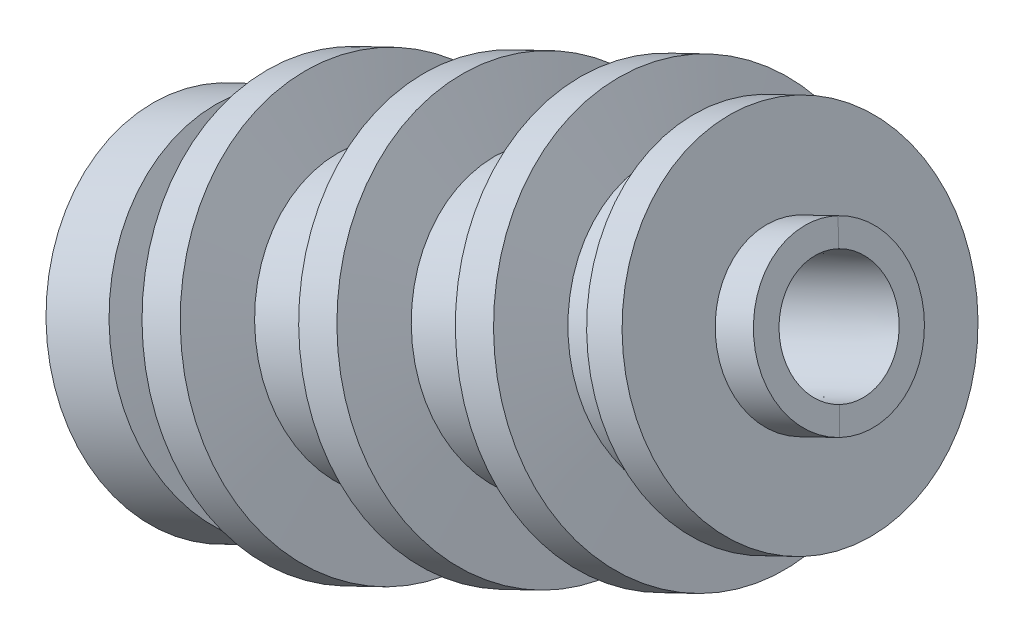
ISO-10303-21;
HEADER;
FILE_DESCRIPTION(('STEP AP214'),'2;1');
FILE_NAME('part.step','',(''),(''),'','','');
FILE_SCHEMA(('AUTOMOTIVE_DESIGN { 1 0 10303 214 1 1 1 1 }'));
ENDSEC;
DATA;
#1=APPLICATION_CONTEXT('core data for automotive mechanical design processes');
#2=APPLICATION_PROTOCOL_DEFINITION('international standard','automotive_design',2000,#1);
#3=PRODUCT_CONTEXT('',#1,'mechanical');
#4=PRODUCT('Part','Part','',(#3));
#5=PRODUCT_RELATED_PRODUCT_CATEGORY('part','',(#4));
#6=PRODUCT_DEFINITION_FORMATION('','',#4);
#7=PRODUCT_DEFINITION_CONTEXT('part definition',#1,'design');
#8=PRODUCT_DEFINITION('design','',#6,#7);
#9=PRODUCT_DEFINITION_SHAPE('','',#8);
#10=(LENGTH_UNIT() NAMED_UNIT(*) SI_UNIT(.MILLI.,.METRE.));
#11=(NAMED_UNIT(*) PLANE_ANGLE_UNIT() SI_UNIT($,.RADIAN.));
#12=(NAMED_UNIT(*) SI_UNIT($,.STERADIAN.) SOLID_ANGLE_UNIT());
#13=UNCERTAINTY_MEASURE_WITH_UNIT(LENGTH_MEASURE(1.E-05),#10,'distance_accuracy_value','');
#14=(GEOMETRIC_REPRESENTATION_CONTEXT(3) GLOBAL_UNCERTAINTY_ASSIGNED_CONTEXT((#13)) GLOBAL_UNIT_ASSIGNED_CONTEXT((#10,
#11,#12)) REPRESENTATION_CONTEXT('',''));
#15=CARTESIAN_POINT('',(0.,0.,0.));
#16=DIRECTION('',(0.,0.,1.));
#17=DIRECTION('',(1.,0.,0.));
#18=AXIS2_PLACEMENT_3D('',#15,#16,#17);
#19=CARTESIAN_POINT('',(10.638451955797,-21.5147818948786,0.));
#20=DIRECTION('',(0.90096886790242,0.433883739117557,0.));
#21=DIRECTION('',(-0.433883739117557,0.90096886790242,0.));
#22=AXIS2_PLACEMENT_3D('',#19,#20,#21);
#23=CYLINDRICAL_SURFACE('',#22,4.5);
#24=CARTESIAN_POINT('',(9.96272530484483,-21.840194699229,0.));
#25=DIRECTION('',(0.900968867902419,0.433883739117557,0.));
#26=DIRECTION('',(0.16891700663179,-0.350759778515863,-0.921105109445203));
#27=AXIS2_PLACEMENT_3D('',#24,#25,#26);
#28=CIRCLE('',#27,4.49999999998767);
#29=CARTESIAN_POINT('',(10.7228518346858,-23.4186137025461,-4.14497299249206));
#30=VERTEX_POINT('',#29);
#31=EDGE_CURVE('E120',#30,#30,#28,.F.);
#32=ORIENTED_EDGE('',*,*,#31,.F.);
#33=EDGE_LOOP('',(#32));
#34=FACE_BOUND('',#33,.T.);
#35=CARTESIAN_POINT('',(10.8636941728005,-21.4063109600858,0.));
#36=DIRECTION('',(-0.90096886790242,-0.433883739117557,0.));
#37=DIRECTION('',(-0.168917006629493,0.350759778511095,0.92110510944744));
#38=AXIS2_PLACEMENT_3D('',#35,#36,#37);
#39=CIRCLE('',#38,4.49999999997674);
#40=CARTESIAN_POINT('',(10.1035676429717,-19.827891956794,4.14497299249206));
#41=VERTEX_POINT('',#40);
#42=EDGE_CURVE('E117',#41,#41,#39,.F.);
#43=ORIENTED_EDGE('',*,*,#42,.F.);
#44=EDGE_LOOP('',(#43));
#45=FACE_BOUND('',#44,.T.);
#46=ADVANCED_FACE('F17',(#34,#45),#23,.T.);
#47=CARTESIAN_POINT('',(9.96272530485679,-21.8401946992232,0.));
#48=DIRECTION('',(0.900968867902419,0.433883739117558,0.));
#49=DIRECTION('',(-0.433883739117558,0.900968867902419,0.));
#50=AXIS2_PLACEMENT_3D('',#47,#48,#49);
#51=CONICAL_SURFACE('',#50,4.50000000010716,1.48352986421664);
#52=ORIENTED_EDGE('',*,*,#31,.T.);
#53=EDGE_LOOP('',(#52));
#54=FACE_BOUND('',#53,.T.);
#55=CARTESIAN_POINT('',(9.84448846167332,-21.8971345619083,0.));
#56=DIRECTION('',(0.900968867902419,0.433883739117557,0.));
#57=DIRECTION('',(-0.433883739117557,0.900968867902419,0.));
#58=AXIS2_PLACEMENT_3D('',#55,#56,#57);
#59=CIRCLE('',#58,3.);
#60=CARTESIAN_POINT('',(8.54283724432064,-19.1942279582011,0.));
#61=VERTEX_POINT('',#60);
#62=EDGE_CURVE('E114',#61,#61,#59,.F.);
#63=ORIENTED_EDGE('',*,*,#62,.F.);
#64=EDGE_LOOP('',(#63));
#65=FACE_BOUND('',#64,.T.);
#66=ADVANCED_FACE('F347',(#54,#65),#51,.T.);
#67=CARTESIAN_POINT('',(10.8636941728005,-21.4063109600858,0.));
#68=DIRECTION('',(-0.90096886790242,-0.433883739117557,0.));
#69=DIRECTION('',(0.433883739117557,-0.900968867902419,0.));
#70=AXIS2_PLACEMENT_3D('',#67,#68,#69);
#71=CONICAL_SURFACE('',#70,4.49999999997674,1.48352986419634);
#72=CARTESIAN_POINT('',(10.9819310159695,-21.3493710974077,0.));
#73=DIRECTION('',(0.90096886790242,0.433883739117557,0.));
#74=DIRECTION('',(-0.433883739117557,0.90096886790242,0.));
#75=AXIS2_PLACEMENT_3D('',#72,#73,#74);
#76=CIRCLE('',#75,3.);
#77=CARTESIAN_POINT('',(9.68027979861681,-18.6464644937004,0.));
#78=VERTEX_POINT('',#77);
#79=EDGE_CURVE('E111',#78,#78,#76,.T.);
#80=ORIENTED_EDGE('',*,*,#79,.F.);
#81=EDGE_LOOP('',(#80));
#82=FACE_BOUND('',#81,.T.);
#83=ORIENTED_EDGE('',*,*,#42,.T.);
#84=EDGE_LOOP('',(#83));
#85=FACE_BOUND('',#84,.T.);
#86=ADVANCED_FACE('F338',(#82,#85),#71,.T.);
#87=CARTESIAN_POINT('',(6.71923738042148,-23.40217616004,0.));
#88=DIRECTION('',(0.900968867902419,0.433883739117557,0.));
#89=DIRECTION('',(-0.433883739117557,0.900968867902419,0.));
#90=AXIS2_PLACEMENT_3D('',#87,#88,#89);
#91=CYLINDRICAL_SURFACE('',#90,3.);
#92=ORIENTED_EDGE('',*,*,#62,.T.);
#93=EDGE_LOOP('',(#92));
#94=FACE_BOUND('',#93,.T.);
#95=CARTESIAN_POINT('',(7.28795865756993,-23.1282944277895,0.));
#96=DIRECTION('',(-0.900968867902419,-0.433883739117557,0.));
#97=DIRECTION('',(-0.168917006629719,0.350759778511564,0.921105109447219));
#98=AXIS2_PLACEMENT_3D('',#95,#96,#97);
#99=CIRCLE('',#98,2.99999999996464);
#100=CARTESIAN_POINT('',(6.78120763768675,-22.0760150922672,2.76331532830909));
#101=VERTEX_POINT('',#100);
#102=EDGE_CURVE('E108',#101,#101,#99,.T.);
#103=ORIENTED_EDGE('',*,*,#102,.F.);
#104=EDGE_LOOP('',(#103));
#105=FACE_BOUND('',#104,.T.);
#106=ADVANCED_FACE('F329',(#94,#105),#91,.T.);
#107=CARTESIAN_POINT('',(14.1071820972213,-19.844329499276,0.));
#108=DIRECTION('',(0.90096886790242,0.433883739117557,0.));
#109=DIRECTION('',(-0.433883739117557,0.90096886790242,0.));
#110=AXIS2_PLACEMENT_3D('',#107,#108,#109);
#111=CYLINDRICAL_SURFACE('',#110,3.);
#112=ORIENTED_EDGE('',*,*,#79,.T.);
#113=EDGE_LOOP('',(#112));
#114=FACE_BOUND('',#113,.T.);
#115=CARTESIAN_POINT('',(13.5384608200643,-20.1182112315306,0.));
#116=DIRECTION('',(0.90096886790242,0.433883739117557,0.));
#117=DIRECTION('',(0.168917006630409,-0.350759778512999,-0.921105109446547));
#118=AXIS2_PLACEMENT_3D('',#115,#116,#117);
#119=CIRCLE('',#118,3.00000000009026);
#120=CARTESIAN_POINT('',(14.0452118399708,-21.1704905671013,-2.76331532842278));
#121=VERTEX_POINT('',#120);
#122=EDGE_CURVE('E105',#121,#121,#119,.T.);
#123=ORIENTED_EDGE('',*,*,#122,.F.);
#124=EDGE_LOOP('',(#123));
#125=FACE_BOUND('',#124,.T.);
#126=ADVANCED_FACE('F320',(#114,#125),#111,.T.);
#127=CARTESIAN_POINT('',(7.16972181435643,-23.185234290489,0.));
#128=DIRECTION('',(-0.900968867902419,-0.433883739117558,0.));
#129=DIRECTION('',(0.433883739117558,-0.900968867902419,0.));
#130=AXIS2_PLACEMENT_3D('',#127,#128,#129);
#131=CONICAL_SURFACE('',#130,4.50000000022809,1.48352986419261);
#132=CARTESIAN_POINT('',(7.16972181437269,-23.1852342904812,0.));
#133=DIRECTION('',(0.900968867902419,0.433883739117557,0.));
#134=DIRECTION('',(-0.433883739117557,0.900968867902419,0.));
#135=AXIS2_PLACEMENT_3D('',#132,#133,#134);
#136=CIRCLE('',#135,4.5);
#137=CARTESIAN_POINT('',(5.21724498834368,-19.1308743849203,0.));
#138=VERTEX_POINT('',#137);
#139=EDGE_CURVE('E102',#138,#138,#136,.F.);
#140=ORIENTED_EDGE('',*,*,#139,.F.);
#141=EDGE_LOOP('',(#140));
#142=FACE_BOUND('',#141,.T.);
#143=ORIENTED_EDGE('',*,*,#102,.T.);
#144=EDGE_LOOP('',(#143));
#145=FACE_BOUND('',#144,.T.);
#146=ADVANCED_FACE('F311',(#142,#145),#131,.T.);
#147=CARTESIAN_POINT('',(13.6566976632769,-20.0612713688315,0.));
#148=DIRECTION('',(0.900968867902419,0.433883739117557,0.));
#149=DIRECTION('',(-0.433883739117557,0.900968867902419,0.));
#150=AXIS2_PLACEMENT_3D('',#147,#148,#149);
#151=CONICAL_SURFACE('',#150,4.50000000022424,1.48352986419261);
#152=ORIENTED_EDGE('',*,*,#122,.T.);
#153=EDGE_LOOP('',(#152));
#154=FACE_BOUND('',#153,.T.);
#155=CARTESIAN_POINT('',(13.6566976632701,-20.0612713688348,0.));
#156=DIRECTION('',(0.90096886790242,0.433883739117557,0.));
#157=DIRECTION('',(-0.433883739117557,0.90096886790242,0.));
#158=AXIS2_PLACEMENT_3D('',#155,#156,#157);
#159=CIRCLE('',#158,4.5);
#160=CARTESIAN_POINT('',(11.7042208372411,-16.0069114632739,0.));
#161=VERTEX_POINT('',#160);
#162=EDGE_CURVE('E99',#161,#161,#159,.T.);
#163=ORIENTED_EDGE('',*,*,#162,.F.);
#164=EDGE_LOOP('',(#163));
#165=FACE_BOUND('',#164,.T.);
#166=ADVANCED_FACE('F302',(#154,#165),#151,.T.);
#167=CARTESIAN_POINT('',(6.71923738042148,-23.40217616004,0.));
#168=DIRECTION('',(0.900968867902419,0.433883739117557,0.));
#169=DIRECTION('',(-0.433883739117557,0.900968867902419,0.));
#170=AXIS2_PLACEMENT_3D('',#167,#168,#169);
#171=CYLINDRICAL_SURFACE('',#170,4.5);
#172=ORIENTED_EDGE('',*,*,#139,.T.);
#173=EDGE_LOOP('',(#172));
#174=FACE_BOUND('',#173,.T.);
#175=CARTESIAN_POINT('',(6.26875294648192,-23.6191180295932,0.));
#176=DIRECTION('',(0.900968867902419,0.433883739117557,0.));
#177=DIRECTION('',(0.168917006627149,-0.350759778506226,-0.921105109449724));
#178=AXIS2_PLACEMENT_3D('',#175,#176,#177);
#179=CIRCLE('',#178,4.5000000000273);
#180=CARTESIAN_POINT('',(7.0288794763087,-25.1975370328807,-4.1449729925489));
#181=VERTEX_POINT('',#180);
#182=EDGE_CURVE('E96',#181,#181,#179,.F.);
#183=ORIENTED_EDGE('',*,*,#182,.F.);
#184=EDGE_LOOP('',(#183));
#185=FACE_BOUND('',#184,.T.);
#186=ADVANCED_FACE('F293',(#174,#185),#171,.T.);
#187=CARTESIAN_POINT('',(14.1071820972213,-19.844329499276,0.));
#188=DIRECTION('',(0.90096886790242,0.433883739117557,0.));
#189=DIRECTION('',(-0.433883739117557,0.90096886790242,0.));
#190=AXIS2_PLACEMENT_3D('',#187,#188,#189);
#191=CYLINDRICAL_SURFACE('',#190,4.5);
#192=ORIENTED_EDGE('',*,*,#162,.T.);
#193=EDGE_LOOP('',(#192));
#194=FACE_BOUND('',#193,.T.);
#195=CARTESIAN_POINT('',(14.5576665311626,-19.627387629722,0.));
#196=DIRECTION('',(-0.90096886790242,-0.433883739117557,0.));
#197=DIRECTION('',(-0.16891700663005,0.350759778512252,0.921105109446897));
#198=AXIS2_PLACEMENT_3D('',#195,#196,#197);
#199=CIRCLE('',#198,4.50000000004111);
#200=CARTESIAN_POINT('',(13.7975400013204,-18.0489686264025,4.1449729925489));
#201=VERTEX_POINT('',#200);
#202=EDGE_CURVE('E93',#201,#201,#199,.F.);
#203=ORIENTED_EDGE('',*,*,#202,.F.);
#204=EDGE_LOOP('',(#203));
#205=FACE_BOUND('',#204,.T.);
#206=ADVANCED_FACE('F284',(#194,#205),#191,.T.);
#207=CARTESIAN_POINT('',(6.26875294648277,-23.6191180295927,0.));
#208=DIRECTION('',(0.900968867902419,0.433883739117558,0.));
#209=DIRECTION('',(-0.433883739117558,0.900968867902419,0.));
#210=AXIS2_PLACEMENT_3D('',#207,#208,#209);
#211=CONICAL_SURFACE('',#210,4.50000000015676,1.48352986420008);
#212=ORIENTED_EDGE('',*,*,#182,.T.);
#213=EDGE_LOOP('',(#212));
#214=FACE_BOUND('',#213,.T.);
#215=CARTESIAN_POINT('',(6.15051610327339,-23.6760578922903,0.));
#216=DIRECTION('',(0.900968867902419,0.433883739117557,0.));
#217=DIRECTION('',(-0.433883739117557,0.900968867902419,0.));
#218=AXIS2_PLACEMENT_3D('',#215,#216,#217);
#219=CIRCLE('',#218,3.);
#220=CARTESIAN_POINT('',(4.84886488592072,-20.973151288583,0.));
#221=VERTEX_POINT('',#220);
#222=EDGE_CURVE('E90',#221,#221,#219,.F.);
#223=ORIENTED_EDGE('',*,*,#222,.F.);
#224=EDGE_LOOP('',(#223));
#225=FACE_BOUND('',#224,.T.);
#226=ADVANCED_FACE('F275',(#214,#225),#211,.T.);
#227=CARTESIAN_POINT('',(14.5576665311386,-19.6273876297336,0.));
#228=DIRECTION('',(-0.90096886790242,-0.433883739117557,0.));
#229=DIRECTION('',(0.433883739117557,-0.900968867902419,0.));
#230=AXIS2_PLACEMENT_3D('',#227,#228,#229);
#231=CONICAL_SURFACE('',#230,4.50000000028009,1.48352986419134);
#232=CARTESIAN_POINT('',(14.6759033743694,-19.5704477670257,0.));
#233=DIRECTION('',(0.90096886790242,0.433883739117557,0.));
#234=DIRECTION('',(-0.433883739117557,0.90096886790242,0.));
#235=AXIS2_PLACEMENT_3D('',#232,#233,#234);
#236=CIRCLE('',#235,3.);
#237=CARTESIAN_POINT('',(13.3742521570167,-16.8675411633184,0.));
#238=VERTEX_POINT('',#237);
#239=EDGE_CURVE('E87',#238,#238,#236,.T.);
#240=ORIENTED_EDGE('',*,*,#239,.F.);
#241=EDGE_LOOP('',(#240));
#242=FACE_BOUND('',#241,.T.);
#243=ORIENTED_EDGE('',*,*,#202,.T.);
#244=EDGE_LOOP('',(#243));
#245=FACE_BOUND('',#244,.T.);
#246=ADVANCED_FACE('F266',(#242,#245),#231,.T.);
#247=CARTESIAN_POINT('',(6.71923738042148,-23.40217616004,0.));
#248=DIRECTION('',(0.900968867902419,0.433883739117557,0.));
#249=DIRECTION('',(-0.433883739117557,0.900968867902419,0.));
#250=AXIS2_PLACEMENT_3D('',#247,#248,#249);
#251=CYLINDRICAL_SURFACE('',#250,3.);
#252=ORIENTED_EDGE('',*,*,#222,.T.);
#253=EDGE_LOOP('',(#252));
#254=FACE_BOUND('',#253,.T.);
#255=CARTESIAN_POINT('',(4.84915519226249,-24.3027602769414,0.));
#256=DIRECTION('',(-0.900968867902419,-0.433883739117557,0.));
#257=DIRECTION('',(-0.168917006627495,0.350759778506943,0.921105109449387));
#258=AXIS2_PLACEMENT_3D('',#255,#256,#257);
#259=CIRCLE('',#258,3.0000000000193);
#260=CARTESIAN_POINT('',(4.34240417237675,-23.2504809414138,2.76331532836593));
#261=VERTEX_POINT('',#260);
#262=EDGE_CURVE('E84',#261,#261,#259,.T.);
#263=ORIENTED_EDGE('',*,*,#262,.F.);
#264=EDGE_LOOP('',(#263));
#265=FACE_BOUND('',#264,.T.);
#266=ADVANCED_FACE('F257',(#254,#265),#251,.T.);
#267=CARTESIAN_POINT('',(14.1071820972213,-19.844329499276,0.));
#268=DIRECTION('',(0.90096886790242,0.433883739117557,0.));
#269=DIRECTION('',(-0.433883739117557,0.90096886790242,0.));
#270=AXIS2_PLACEMENT_3D('',#267,#268,#269);
#271=CYLINDRICAL_SURFACE('',#270,3.);
#272=ORIENTED_EDGE('',*,*,#239,.T.);
#273=EDGE_LOOP('',(#272));
#274=FACE_BOUND('',#273,.T.);
#275=CARTESIAN_POINT('',(15.9772642854059,-18.9437453823623,0.));
#276=DIRECTION('',(0.90096886790242,0.433883739117557,0.));
#277=DIRECTION('',(0.168917006632451,-0.350759778517238,-0.921105109444558));
#278=AXIS2_PLACEMENT_3D('',#275,#276,#277);
#279=CIRCLE('',#278,3.00000000003502);
#280=CARTESIAN_POINT('',(16.4840153053092,-19.9960247179263,-2.76331532836593));
#281=VERTEX_POINT('',#280);
#282=EDGE_CURVE('E81',#281,#281,#279,.T.);
#283=ORIENTED_EDGE('',*,*,#282,.F.);
#284=EDGE_LOOP('',(#283));
#285=FACE_BOUND('',#284,.T.);
#286=ADVANCED_FACE('F248',(#274,#285),#271,.T.);
#287=CARTESIAN_POINT('',(4.78215431440969,-24.3350261991531,0.));
#288=DIRECTION('',(-0.90096886790242,-0.433883739117557,0.));
#289=DIRECTION('',(0.433883739117557,-0.90096886790242,0.));
#290=AXIS2_PLACEMENT_3D('',#287,#288,#289);
#291=CONICAL_SURFACE('',#290,3.85000000032709,1.48352986417647);
#292=CARTESIAN_POINT('',(4.78215431443128,-24.3350261991427,0.));
#293=DIRECTION('',(0.900968867902419,0.433883739117557,0.));
#294=DIRECTION('',(-0.433883739117557,0.900968867902419,0.));
#295=AXIS2_PLACEMENT_3D('',#292,#293,#294);
#296=CIRCLE('',#295,3.85);
#297=CARTESIAN_POINT('',(3.11170191882868,-20.8662960577184,0.));
#298=VERTEX_POINT('',#297);
#299=EDGE_CURVE('E78',#298,#298,#296,.F.);
#300=ORIENTED_EDGE('',*,*,#299,.F.);
#301=EDGE_LOOP('',(#300));
#302=FACE_BOUND('',#301,.T.);
#303=ORIENTED_EDGE('',*,*,#262,.T.);
#304=EDGE_LOOP('',(#303));
#305=FACE_BOUND('',#304,.T.);
#306=ADVANCED_FACE('F239',(#302,#305),#291,.T.);
#307=CARTESIAN_POINT('',(16.0442651632109,-18.9114794601736,0.));
#308=DIRECTION('',(0.90096886790242,0.433883739117558,0.));
#309=DIRECTION('',(-0.433883739117558,0.90096886790242,0.));
#310=AXIS2_PLACEMENT_3D('',#307,#308,#309);
#311=CONICAL_SURFACE('',#310,3.85000000002194,1.4835298642024);
#312=ORIENTED_EDGE('',*,*,#282,.T.);
#313=EDGE_LOOP('',(#312));
#314=FACE_BOUND('',#313,.T.);
#315=CARTESIAN_POINT('',(16.0442651632115,-18.9114794601733,0.));
#316=DIRECTION('',(0.90096886790242,0.433883739117557,0.));
#317=DIRECTION('',(-0.433883739117557,0.90096886790242,0.));
#318=AXIS2_PLACEMENT_3D('',#315,#316,#317);
#319=CIRCLE('',#318,3.85);
#320=CARTESIAN_POINT('',(14.3738127676089,-15.442749318749,0.));
#321=VERTEX_POINT('',#320);
#322=EDGE_CURVE('E75',#321,#321,#319,.T.);
#323=ORIENTED_EDGE('',*,*,#322,.F.);
#324=EDGE_LOOP('',(#323));
#325=FACE_BOUND('',#324,.T.);
#326=ADVANCED_FACE('F230',(#314,#325),#311,.T.);
#327=CARTESIAN_POINT('',(3.98253423035766,-24.7201029363213,0.));
#328=DIRECTION('',(0.900968867902419,0.433883739117557,0.));
#329=DIRECTION('',(-0.433883739117557,0.900968867902419,0.));
#330=AXIS2_PLACEMENT_3D('',#327,#328,#329);
#331=CYLINDRICAL_SURFACE('',#330,3.85);
#332=ORIENTED_EDGE('',*,*,#299,.T.);
#333=EDGE_LOOP('',(#332));
#334=FACE_BOUND('',#333,.T.);
#335=CARTESIAN_POINT('',(3.29555568239228,-25.0509343686867,0.));
#336=DIRECTION('',(0.900968867902419,0.433883739117557,0.));
#337=DIRECTION('',(-0.433883739117557,0.900968867902419,0.));
#338=AXIS2_PLACEMENT_3D('',#335,#336,#337);
#339=CIRCLE('',#338,3.85);
#340=CARTESIAN_POINT('',(1.62510328678969,-21.5822042272624,0.));
#341=VERTEX_POINT('',#340);
#342=EDGE_CURVE('E20',#341,#341,#339,.T.);
#343=ORIENTED_EDGE('',*,*,#342,.T.);
#344=EDGE_LOOP('',(#343));
#345=FACE_BOUND('',#344,.T.);
#346=ADVANCED_FACE('F145',(#334,#345),#331,.T.);
#347=CARTESIAN_POINT('',(16.8438852472851,-18.5264027229947,0.));
#348=DIRECTION('',(0.90096886790242,0.433883739117557,0.));
#349=DIRECTION('',(-0.433883739117557,0.90096886790242,0.));
#350=AXIS2_PLACEMENT_3D('',#347,#348,#349);
#351=CYLINDRICAL_SURFACE('',#350,3.85);
#352=ORIENTED_EDGE('',*,*,#322,.T.);
#353=EDGE_LOOP('',(#352));
#354=FACE_BOUND('',#353,.T.);
#355=CARTESIAN_POINT('',(16.8801358654364,-18.5089453453769,0.));
#356=DIRECTION('',(-0.90096886790242,-0.433883739117557,0.));
#357=DIRECTION('',(-0.168917006628051,0.350759778508101,0.921105109448844));
#358=AXIS2_PLACEMENT_3D('',#355,#356,#357);
#359=CIRCLE('',#358,3.84999999995298);
#360=CARTESIAN_POINT('',(16.2298053899264,-17.1585201981372,3.54625467133474));
#361=VERTEX_POINT('',#360);
#362=EDGE_CURVE('E72',#361,#361,#359,.F.);
#363=ORIENTED_EDGE('',*,*,#362,.F.);
#364=EDGE_LOOP('',(#363));
#365=FACE_BOUND('',#364,.T.);
#366=ADVANCED_FACE('F135',(#354,#365),#351,.T.);
#367=CARTESIAN_POINT('',(3.77696915128695,-26.0505997374446,-2.62514956192461));
#368=DIRECTION('',(0.90096886790242,0.433883739117557,0.));
#369=DIRECTION('',(-0.433883739117557,0.90096886790242,0.));
#370=AXIS2_PLACEMENT_3D('',#367,#368,#369);
#371=PLANE('',#370);
#372=ORIENTED_EDGE('',*,*,#342,.F.);
#373=EDGE_LOOP('',(#372));
#374=FACE_BOUND('',#373,.T.);
#375=CARTESIAN_POINT('',(3.29555568239229,-25.0509343686867,0.));
#376=DIRECTION('',(0.90096886790242,0.433883739117557,0.));
#377=DIRECTION('',(-0.433883739117557,0.90096886790242,0.));
#378=AXIS2_PLACEMENT_3D('',#375,#376,#377);
#379=CIRCLE('',#378,2.85);
#380=CARTESIAN_POINT('',(2.05898702590725,-22.4831730951648,0.));
#381=VERTEX_POINT('',#380);
#382=EDGE_CURVE('E71',#381,#381,#379,.F.);
#383=ORIENTED_EDGE('',*,*,#382,.F.);
#384=EDGE_LOOP('',(#383));
#385=FACE_BOUND('',#384,.T.);
#386=ADVANCED_FACE('F132',(#374,#385),#371,.F.);
#387=CARTESIAN_POINT('',(16.8801358654113,-18.508945345389,0.));
#388=DIRECTION('',(-0.900968867902419,-0.433883739117557,0.));
#389=DIRECTION('',(0.433883739117557,-0.900968867902419,0.));
#390=AXIS2_PLACEMENT_3D('',#387,#388,#389);
#391=CONICAL_SURFACE('',#390,3.85000000255028,1.5620696805351);
#392=CARTESIAN_POINT('',(16.8958611378122,-18.5013724533269,0.));
#393=DIRECTION('',(0.90096886790242,0.433883739117557,0.));
#394=DIRECTION('',(-0.433883739117557,0.90096886790242,0.));
#395=AXIS2_PLACEMENT_3D('',#392,#393,#394);
#396=CIRCLE('',#395,1.85);
#397=CARTESIAN_POINT('',(16.0931762204448,-16.8345800477074,0.));
#398=VERTEX_POINT('',#397);
#399=EDGE_CURVE('E52',#398,#398,#396,.T.);
#400=ORIENTED_EDGE('',*,*,#399,.F.);
#401=EDGE_LOOP('',(#400));
#402=FACE_BOUND('',#401,.T.);
#403=ORIENTED_EDGE('',*,*,#362,.T.);
#404=EDGE_LOOP('',(#403));
#405=FACE_BOUND('',#404,.T.);
#406=ADVANCED_FACE('F134',(#402,#405),#391,.T.);
#407=CARTESIAN_POINT('',(3.19982263327255,-25.0970369753238,0.));
#408=DIRECTION('',(0.90096886790242,0.433883739117557,0.));
#409=DIRECTION('',(-0.433883739117557,0.90096886790242,0.));
#410=AXIS2_PLACEMENT_3D('',#407,#408,#409);
#411=CYLINDRICAL_SURFACE('',#410,2.85);
#412=ORIENTED_EDGE('',*,*,#382,.T.);
#413=EDGE_LOOP('',(#412));
#414=FACE_BOUND('',#413,.T.);
#415=CARTESIAN_POINT('',(3.02526502202156,-25.181099490422,0.));
#416=DIRECTION('',(0.90096886790242,0.433883739117557,0.));
#417=DIRECTION('',(-0.433883739117557,0.90096886790242,0.));
#418=AXIS2_PLACEMENT_3D('',#415,#416,#417);
#419=CIRCLE('',#418,2.85);
#420=CARTESIAN_POINT('',(1.78869636553652,-22.6133382169001,0.));
#421=VERTEX_POINT('',#420);
#422=EDGE_CURVE('E51',#421,#421,#419,.T.);
#423=ORIENTED_EDGE('',*,*,#422,.T.);
#424=EDGE_LOOP('',(#423));
#425=FACE_BOUND('',#424,.T.);
#426=ADVANCED_FACE('F129',(#414,#425),#411,.T.);
#427=CARTESIAN_POINT('',(17.3463455717635,-18.2844305837681,0.));
#428=DIRECTION('',(0.90096886790242,0.433883739117557,0.));
#429=DIRECTION('',(-0.433883739117557,0.90096886790242,0.));
#430=AXIS2_PLACEMENT_3D('',#427,#428,#429);
#431=CYLINDRICAL_SURFACE('',#430,1.85);
#432=CARTESIAN_POINT('',(17.7968300057409,-18.0674887141967,0.));
#433=DIRECTION('',(-0.90096886790242,-0.433883739117557,0.));
#434=DIRECTION('',(-0.399652529007726,0.829887027678792,-0.389313982985698));
#435=AXIS2_PLACEMENT_3D('',#432,#433,#434);
#436=CIRCLE('',#435,1.85000000000036);
#437=CARTESIAN_POINT('',(17.057472826961,-16.5321977127624,-0.720230868626421));
#438=VERTEX_POINT('',#437);
#439=CARTESIAN_POINT('',(18.5361871831019,-19.6027797127048,0.720230867245537));
#440=VERTEX_POINT('',#439);
#441=EDGE_CURVE('E43',#438,#440,#436,.F.);
#442=ORIENTED_EDGE('',*,*,#441,.F.);
#443=CARTESIAN_POINT('',(17.7968300057409,-18.0674887141967,0.));
#444=DIRECTION('',(-0.90096886790242,-0.433883739117557,0.));
#445=DIRECTION('',(-0.399652529007726,0.829887027678792,-0.389313982985698));
#446=AXIS2_PLACEMENT_3D('',#443,#444,#445);
#447=CIRCLE('',#446,1.85000000000036);
#448=EDGE_CURVE('E56',#440,#438,#447,.F.);
#449=ORIENTED_EDGE('',*,*,#448,.F.);
#450=EDGE_LOOP('',(#442,#449));
#451=FACE_BOUND('',#450,.T.);
#452=ORIENTED_EDGE('',*,*,#399,.T.);
#453=EDGE_LOOP('',(#452));
#454=FACE_BOUND('',#453,.T.);
#455=ADVANCED_FACE('F58',(#451,#454),#431,.T.);
#456=CARTESIAN_POINT('',(17.7968300057103,-18.0674887142114,0.));
#457=DIRECTION('',(-0.900968867902419,-0.433883739117559,0.));
#458=DIRECTION('',(0.433883739117558,-0.900968867902419,0.));
#459=AXIS2_PLACEMENT_3D('',#456,#457,#458);
#460=CONICAL_SURFACE('',#459,1.85000000248374,1.56206968051368);
#461=DIRECTION('',(0.407499648267489,-0.826069126273463,0.389299159104757));
#462=VECTOR('',#461,1.);
#463=CARTESIAN_POINT('',(-246147.645797917,499000.,-235170.768578168));
#464=LINE('',#463,#462);
#465=CARTESIAN_POINT('',(17.2816061679133,-16.9865530329121,-0.50610817788476));
#466=VERTEX_POINT('',#465);
#467=EDGE_CURVE('E48',#438,#466,#464,.T.);
#468=ORIENTED_EDGE('',*,*,#467,.F.);
#469=ORIENTED_EDGE('',*,*,#441,.T.);
#470=DIRECTION('',(-0.391774974659596,0.833641729971919,-0.389299159105051));
#471=VECTOR('',#470,1.);
#472=CARTESIAN_POINT('',(236684.189264454,-503610.636453301,235170.768578346));
#473=LINE('',#472,#471);
#474=CARTESIAN_POINT('',(18.3207027432647,-19.1442593048039,0.5061081778206));
#475=VERTEX_POINT('',#474);
#476=EDGE_CURVE('E46',#475,#440,#473,.F.);
#477=ORIENTED_EDGE('',*,*,#476,.F.);
#478=CARTESIAN_POINT('',(17.8011544556227,-18.0654061688934,0.));
#479=DIRECTION('',(-0.90096886790242,-0.433883739117557,0.));
#480=DIRECTION('',(-0.168917006629518,0.350759778511403,0.921105109447318));
#481=AXIS2_PLACEMENT_3D('',#478,#479,#480);
#482=CIRCLE('',#481,1.30000000000005);
#483=EDGE_CURVE('E33',#475,#466,#482,.T.);
#484=ORIENTED_EDGE('',*,*,#483,.T.);
#485=EDGE_LOOP('',(#468,#469,#477,#484));
#486=FACE_BOUND('',#485,.T.);
#487=ADVANCED_FACE('F45',(#486),#460,.T.);
#488=CARTESIAN_POINT('',(3.24485713064018,-25.637087202487,-1.1974366422814));
#489=DIRECTION('',(0.90096886790242,0.433883739117557,0.));
#490=DIRECTION('',(-0.433883739117557,0.90096886790242,0.));
#491=AXIS2_PLACEMENT_3D('',#488,#489,#490);
#492=PLANE('',#491);
#493=ORIENTED_EDGE('',*,*,#422,.F.);
#494=EDGE_LOOP('',(#493));
#495=FACE_BOUND('',#494,.T.);
#496=CARTESIAN_POINT('',(3.02526502210745,-25.1810994903807,0.));
#497=DIRECTION('',(-0.900968867902412,-0.433883739117574,0.));
#498=DIRECTION('',(0.433883739117574,-0.900968867902412,0.));
#499=AXIS2_PLACEMENT_3D('',#496,#497,#498);
#500=CIRCLE('',#499,1.35724703197317);
#501=CARTESIAN_POINT('',(3.6141524392462,-26.4039368122414,0.));
#502=VERTEX_POINT('',#501);
#503=EDGE_CURVE('E26',#502,#502,#500,.F.);
#504=ORIENTED_EDGE('',*,*,#503,.T.);
#505=EDGE_LOOP('',(#504));
#506=FACE_BOUND('',#505,.T.);
#507=ADVANCED_FACE('F156',(#495,#506),#492,.F.);
#508=CARTESIAN_POINT('',(17.7968300057103,-18.0674887142114,0.));
#509=DIRECTION('',(-0.900968867902419,-0.433883739117559,0.));
#510=DIRECTION('',(0.433883739117558,-0.900968867902419,0.));
#511=AXIS2_PLACEMENT_3D('',#508,#509,#510);
#512=CONICAL_SURFACE('',#511,1.85000000248374,1.56206968052529);
#513=ORIENTED_EDGE('',*,*,#448,.T.);
#514=ORIENTED_EDGE('',*,*,#467,.T.);
#515=CARTESIAN_POINT('',(17.8011544556227,-18.0654061688934,0.));
#516=DIRECTION('',(-0.90096886790242,-0.433883739117557,0.));
#517=DIRECTION('',(-0.168917006629518,0.350759778511403,0.921105109447318));
#518=AXIS2_PLACEMENT_3D('',#515,#516,#517);
#519=CIRCLE('',#518,1.30000000000005);
#520=EDGE_CURVE('E11',#466,#475,#519,.T.);
#521=ORIENTED_EDGE('',*,*,#520,.T.);
#522=ORIENTED_EDGE('',*,*,#476,.T.);
#523=EDGE_LOOP('',(#513,#514,#521,#522));
#524=FACE_BOUND('',#523,.T.);
#525=ADVANCED_FACE('F55',(#524),#512,.T.);
#526=CARTESIAN_POINT('',(3.02526502223429,-25.1810994903196,0.));
#527=DIRECTION('',(-0.900968867902412,-0.433883739117574,0.));
#528=DIRECTION('',(0.433883739117574,-0.900968867902412,0.));
#529=AXIS2_PLACEMENT_3D('',#526,#527,#528);
#530=CONICAL_SURFACE('',#529,1.35724703197268,0.00349065850363049);
#531=ORIENTED_EDGE('',*,*,#503,.F.);
#532=EDGE_LOOP('',(#531));
#533=FACE_BOUND('',#532,.T.);
#534=ORIENTED_EDGE('',*,*,#520,.F.);
#535=ORIENTED_EDGE('',*,*,#483,.F.);
#536=EDGE_LOOP('',(#534,#535));
#537=FACE_BOUND('',#536,.T.);
#538=ADVANCED_FACE('F149',(#533,#537),#530,.F.);
#539=CLOSED_SHELL('',(#46,#66,#86,#106,#126,#146,#166,#186,#206,#226,#246,#266,#286,#306,#326,
#346,#366,#386,#406,#426,#455,#487,#507,#525,#538));
#540=MANIFOLD_SOLID_BREP('B1',#539);
#541=ADVANCED_BREP_SHAPE_REPRESENTATION('',(#18,#540),#14);
#542=SHAPE_DEFINITION_REPRESENTATION(#9,#541);
ENDSEC;
END-ISO-10303-21;
